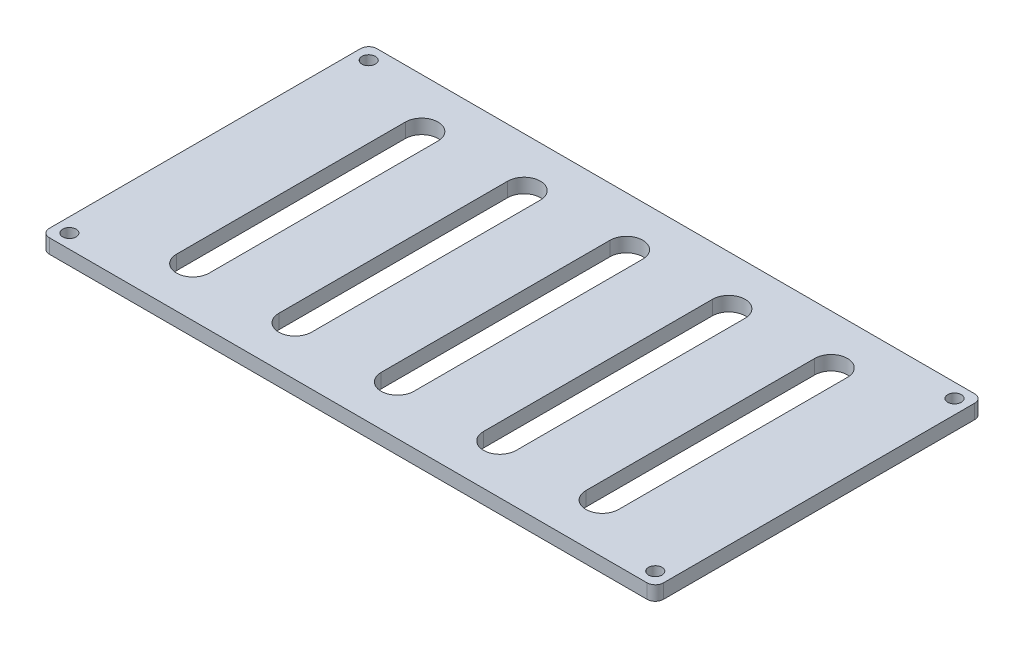
ISO-10303-21;
HEADER;
FILE_DESCRIPTION(('STEP AP214'),'2;1');
FILE_NAME('part.step','',(''),(''),'','','');
FILE_SCHEMA(('AUTOMOTIVE_DESIGN { 1 0 10303 214 1 1 1 1 }'));
ENDSEC;
DATA;
#1=APPLICATION_CONTEXT('core data for automotive mechanical design processes');
#2=APPLICATION_PROTOCOL_DEFINITION('international standard','automotive_design',2000,#1);
#3=PRODUCT_CONTEXT('',#1,'mechanical');
#4=PRODUCT('Part','Part','',(#3));
#5=PRODUCT_RELATED_PRODUCT_CATEGORY('part','',(#4));
#6=PRODUCT_DEFINITION_FORMATION('','',#4);
#7=PRODUCT_DEFINITION_CONTEXT('part definition',#1,'design');
#8=PRODUCT_DEFINITION('design','',#6,#7);
#9=PRODUCT_DEFINITION_SHAPE('','',#8);
#10=(LENGTH_UNIT() NAMED_UNIT(*) SI_UNIT(.MILLI.,.METRE.));
#11=(NAMED_UNIT(*) PLANE_ANGLE_UNIT() SI_UNIT($,.RADIAN.));
#12=(NAMED_UNIT(*) SI_UNIT($,.STERADIAN.) SOLID_ANGLE_UNIT());
#13=UNCERTAINTY_MEASURE_WITH_UNIT(LENGTH_MEASURE(1.E-05),#10,'distance_accuracy_value','');
#14=(GEOMETRIC_REPRESENTATION_CONTEXT(3) GLOBAL_UNCERTAINTY_ASSIGNED_CONTEXT((#13)) GLOBAL_UNIT_ASSIGNED_CONTEXT((#10,
#11,#12)) REPRESENTATION_CONTEXT('',''));
#15=CARTESIAN_POINT('',(0.,0.,0.));
#16=DIRECTION('',(0.,0.,1.));
#17=DIRECTION('',(1.,0.,0.));
#18=AXIS2_PLACEMENT_3D('',#15,#16,#17);
#19=CARTESIAN_POINT('',(-73.,3.5,-38.));
#20=DIRECTION('',(0.,-1.,0.));
#21=DIRECTION('',(0.,0.,-1.));
#22=AXIS2_PLACEMENT_3D('',#19,#20,#21);
#23=CYLINDRICAL_SURFACE('',#22,2.);
#24=CARTESIAN_POINT('',(-73.,0.,-38.));
#25=DIRECTION('',(0.,1.,0.));
#26=DIRECTION('',(0.,0.,1.));
#27=AXIS2_PLACEMENT_3D('',#24,#25,#26);
#28=CIRCLE('',#27,2.);
#29=CARTESIAN_POINT('',(-75.,0.,-38.));
#30=VERTEX_POINT('',#29);
#31=CARTESIAN_POINT('',(-73.,0.,-40.));
#32=VERTEX_POINT('',#31);
#33=EDGE_CURVE('E361',#30,#32,#28,.F.);
#34=ORIENTED_EDGE('',*,*,#33,.F.);
#35=DIRECTION('',(0.,-1.,0.));
#36=VECTOR('',#35,1.);
#37=CARTESIAN_POINT('',(-75.,3.5,-38.));
#38=LINE('',#37,#36);
#39=CARTESIAN_POINT('',(-75.,3.5,-38.));
#40=VERTEX_POINT('',#39);
#41=EDGE_CURVE('E11',#40,#30,#38,.T.);
#42=ORIENTED_EDGE('',*,*,#41,.F.);
#43=CARTESIAN_POINT('',(-73.,3.5,-38.));
#44=DIRECTION('',(0.,1.,0.));
#45=DIRECTION('',(0.,0.,1.));
#46=AXIS2_PLACEMENT_3D('',#43,#44,#45);
#47=CIRCLE('',#46,2.);
#48=CARTESIAN_POINT('',(-73.,3.5,-40.));
#49=VERTEX_POINT('',#48);
#50=EDGE_CURVE('E566',#40,#49,#47,.F.);
#51=ORIENTED_EDGE('',*,*,#50,.T.);
#52=DIRECTION('',(0.,-1.,0.));
#53=VECTOR('',#52,1.);
#54=CARTESIAN_POINT('',(-73.,3.5,-40.));
#55=LINE('',#54,#53);
#56=EDGE_CURVE('E59',#49,#32,#55,.T.);
#57=ORIENTED_EDGE('',*,*,#56,.T.);
#58=EDGE_LOOP('',(#34,#42,#51,#57));
#59=FACE_BOUND('',#58,.T.);
#60=ADVANCED_FACE('F39',(#59),#23,.T.);
#61=CARTESIAN_POINT('',(-75.,3.5,0.));
#62=DIRECTION('',(-1.,0.,0.));
#63=DIRECTION('',(0.,0.,1.));
#64=AXIS2_PLACEMENT_3D('',#61,#62,#63);
#65=PLANE('',#64);
#66=DIRECTION('',(0.,0.,-1.));
#67=VECTOR('',#66,1.);
#68=CARTESIAN_POINT('',(-75.,0.,0.));
#69=LINE('',#68,#67);
#70=CARTESIAN_POINT('',(-75.,0.,38.));
#71=VERTEX_POINT('',#70);
#72=EDGE_CURVE('E364',#71,#30,#69,.T.);
#73=ORIENTED_EDGE('',*,*,#72,.F.);
#74=DIRECTION('',(0.,-1.,0.));
#75=VECTOR('',#74,1.);
#76=CARTESIAN_POINT('',(-75.,3.5,38.));
#77=LINE('',#76,#75);
#78=CARTESIAN_POINT('',(-75.,3.5,38.));
#79=VERTEX_POINT('',#78);
#80=EDGE_CURVE('E50',#79,#71,#77,.T.);
#81=ORIENTED_EDGE('',*,*,#80,.F.);
#82=DIRECTION('',(0.,0.,-1.));
#83=VECTOR('',#82,1.);
#84=CARTESIAN_POINT('',(-75.,3.5,0.));
#85=LINE('',#84,#83);
#86=EDGE_CURVE('E569',#79,#40,#85,.T.);
#87=ORIENTED_EDGE('',*,*,#86,.T.);
#88=ORIENTED_EDGE('',*,*,#41,.T.);
#89=EDGE_LOOP('',(#73,#81,#87,#88));
#90=FACE_BOUND('',#89,.T.);
#91=ADVANCED_FACE('F603',(#90),#65,.T.);
#92=CARTESIAN_POINT('',(-73.,3.5,38.));
#93=DIRECTION('',(0.,-1.,0.));
#94=DIRECTION('',(0.,0.,-1.));
#95=AXIS2_PLACEMENT_3D('',#92,#93,#94);
#96=CYLINDRICAL_SURFACE('',#95,2.);
#97=CARTESIAN_POINT('',(-73.,0.,38.));
#98=DIRECTION('',(0.,1.,0.));
#99=DIRECTION('',(0.,0.,1.));
#100=AXIS2_PLACEMENT_3D('',#97,#98,#99);
#101=CIRCLE('',#100,2.);
#102=CARTESIAN_POINT('',(-73.,0.,40.));
#103=VERTEX_POINT('',#102);
#104=EDGE_CURVE('E368',#103,#71,#101,.F.);
#105=ORIENTED_EDGE('',*,*,#104,.F.);
#106=DIRECTION('',(0.,-1.,0.));
#107=VECTOR('',#106,1.);
#108=CARTESIAN_POINT('',(-73.,3.5,40.));
#109=LINE('',#108,#107);
#110=CARTESIAN_POINT('',(-73.,3.5,40.));
#111=VERTEX_POINT('',#110);
#112=EDGE_CURVE('E408',#111,#103,#109,.T.);
#113=ORIENTED_EDGE('',*,*,#112,.F.);
#114=CARTESIAN_POINT('',(-73.,3.5,38.));
#115=DIRECTION('',(0.,1.,0.));
#116=DIRECTION('',(0.,0.,1.));
#117=AXIS2_PLACEMENT_3D('',#114,#115,#116);
#118=CIRCLE('',#117,2.);
#119=EDGE_CURVE('E573',#111,#79,#118,.F.);
#120=ORIENTED_EDGE('',*,*,#119,.T.);
#121=ORIENTED_EDGE('',*,*,#80,.T.);
#122=EDGE_LOOP('',(#105,#113,#120,#121));
#123=FACE_BOUND('',#122,.T.);
#124=ADVANCED_FACE('F608',(#123),#96,.T.);
#125=CARTESIAN_POINT('',(0.,3.5,40.));
#126=DIRECTION('',(0.,0.,-1.));
#127=DIRECTION('',(-1.,0.,0.));
#128=AXIS2_PLACEMENT_3D('',#125,#126,#127);
#129=PLANE('',#128);
#130=DIRECTION('',(1.,0.,0.));
#131=VECTOR('',#130,1.);
#132=CARTESIAN_POINT('',(0.,0.,40.));
#133=LINE('',#132,#131);
#134=CARTESIAN_POINT('',(73.,0.,40.));
#135=VERTEX_POINT('',#134);
#136=EDGE_CURVE('E372',#103,#135,#133,.T.);
#137=ORIENTED_EDGE('',*,*,#136,.T.);
#138=DIRECTION('',(0.,-1.,0.));
#139=VECTOR('',#138,1.);
#140=CARTESIAN_POINT('',(73.,3.5,40.));
#141=LINE('',#140,#139);
#142=CARTESIAN_POINT('',(73.,3.5,40.));
#143=VERTEX_POINT('',#142);
#144=EDGE_CURVE('E405',#143,#135,#141,.T.);
#145=ORIENTED_EDGE('',*,*,#144,.F.);
#146=DIRECTION('',(1.,0.,0.));
#147=VECTOR('',#146,1.);
#148=CARTESIAN_POINT('',(0.,3.5,40.));
#149=LINE('',#148,#147);
#150=EDGE_CURVE('E577',#111,#143,#149,.T.);
#151=ORIENTED_EDGE('',*,*,#150,.F.);
#152=ORIENTED_EDGE('',*,*,#112,.T.);
#153=EDGE_LOOP('',(#137,#145,#151,#152));
#154=FACE_BOUND('',#153,.T.);
#155=ADVANCED_FACE('F755',(#154),#129,.F.);
#156=CARTESIAN_POINT('',(73.,3.5,38.));
#157=DIRECTION('',(0.,-1.,0.));
#158=DIRECTION('',(0.,0.,-1.));
#159=AXIS2_PLACEMENT_3D('',#156,#157,#158);
#160=CYLINDRICAL_SURFACE('',#159,2.);
#161=CARTESIAN_POINT('',(73.,0.,38.));
#162=DIRECTION('',(0.,1.,0.));
#163=DIRECTION('',(0.,0.,1.));
#164=AXIS2_PLACEMENT_3D('',#161,#162,#163);
#165=CIRCLE('',#164,2.);
#166=CARTESIAN_POINT('',(75.,0.,38.));
#167=VERTEX_POINT('',#166);
#168=EDGE_CURVE('E376',#167,#135,#165,.F.);
#169=ORIENTED_EDGE('',*,*,#168,.F.);
#170=DIRECTION('',(0.,-1.,0.));
#171=VECTOR('',#170,1.);
#172=CARTESIAN_POINT('',(75.,3.5,38.));
#173=LINE('',#172,#171);
#174=CARTESIAN_POINT('',(75.,3.5,38.));
#175=VERTEX_POINT('',#174);
#176=EDGE_CURVE('E254',#175,#167,#173,.T.);
#177=ORIENTED_EDGE('',*,*,#176,.F.);
#178=CARTESIAN_POINT('',(73.,3.5,38.));
#179=DIRECTION('',(0.,1.,0.));
#180=DIRECTION('',(0.,0.,1.));
#181=AXIS2_PLACEMENT_3D('',#178,#179,#180);
#182=CIRCLE('',#181,2.);
#183=EDGE_CURVE('E242',#175,#143,#182,.F.);
#184=ORIENTED_EDGE('',*,*,#183,.T.);
#185=ORIENTED_EDGE('',*,*,#144,.T.);
#186=EDGE_LOOP('',(#169,#177,#184,#185));
#187=FACE_BOUND('',#186,.T.);
#188=ADVANCED_FACE('F582',(#187),#160,.T.);
#189=CARTESIAN_POINT('',(75.,3.5,0.));
#190=DIRECTION('',(-1.,0.,0.));
#191=DIRECTION('',(0.,0.,1.));
#192=AXIS2_PLACEMENT_3D('',#189,#190,#191);
#193=PLANE('',#192);
#194=DIRECTION('',(0.,0.,-1.));
#195=VECTOR('',#194,1.);
#196=CARTESIAN_POINT('',(75.,0.,0.));
#197=LINE('',#196,#195);
#198=CARTESIAN_POINT('',(75.,0.,-38.));
#199=VERTEX_POINT('',#198);
#200=EDGE_CURVE('E250',#167,#199,#197,.T.);
#201=ORIENTED_EDGE('',*,*,#200,.T.);
#202=DIRECTION('',(0.,-1.,0.));
#203=VECTOR('',#202,1.);
#204=CARTESIAN_POINT('',(75.,3.5,-38.));
#205=LINE('',#204,#203);
#206=CARTESIAN_POINT('',(75.,3.5,-38.));
#207=VERTEX_POINT('',#206);
#208=EDGE_CURVE('E247',#207,#199,#205,.T.);
#209=ORIENTED_EDGE('',*,*,#208,.F.);
#210=DIRECTION('',(0.,0.,-1.));
#211=VECTOR('',#210,1.);
#212=CARTESIAN_POINT('',(75.,3.5,0.));
#213=LINE('',#212,#211);
#214=EDGE_CURVE('E233',#175,#207,#213,.T.);
#215=ORIENTED_EDGE('',*,*,#214,.F.);
#216=ORIENTED_EDGE('',*,*,#176,.T.);
#217=EDGE_LOOP('',(#201,#209,#215,#216));
#218=FACE_BOUND('',#217,.T.);
#219=ADVANCED_FACE('F248',(#218),#193,.F.);
#220=CARTESIAN_POINT('',(73.,3.5,-38.));
#221=DIRECTION('',(0.,-1.,0.));
#222=DIRECTION('',(0.,0.,-1.));
#223=AXIS2_PLACEMENT_3D('',#220,#221,#222);
#224=CYLINDRICAL_SURFACE('',#223,2.);
#225=CARTESIAN_POINT('',(73.,0.,-38.));
#226=DIRECTION('',(0.,1.,0.));
#227=DIRECTION('',(0.,0.,1.));
#228=AXIS2_PLACEMENT_3D('',#225,#226,#227);
#229=CIRCLE('',#228,2.);
#230=CARTESIAN_POINT('',(73.,0.,-40.));
#231=VERTEX_POINT('',#230);
#232=EDGE_CURVE('E382',#231,#199,#229,.F.);
#233=ORIENTED_EDGE('',*,*,#232,.F.);
#234=DIRECTION('',(0.,-1.,0.));
#235=VECTOR('',#234,1.);
#236=CARTESIAN_POINT('',(73.,3.5,-40.));
#237=LINE('',#236,#235);
#238=CARTESIAN_POINT('',(73.,3.5,-40.));
#239=VERTEX_POINT('',#238);
#240=EDGE_CURVE('E144',#239,#231,#237,.T.);
#241=ORIENTED_EDGE('',*,*,#240,.F.);
#242=CARTESIAN_POINT('',(73.,3.5,-38.));
#243=DIRECTION('',(0.,1.,0.));
#244=DIRECTION('',(0.,0.,1.));
#245=AXIS2_PLACEMENT_3D('',#242,#243,#244);
#246=CIRCLE('',#245,2.);
#247=EDGE_CURVE('E240',#239,#207,#246,.F.);
#248=ORIENTED_EDGE('',*,*,#247,.T.);
#249=ORIENTED_EDGE('',*,*,#208,.T.);
#250=EDGE_LOOP('',(#233,#241,#248,#249));
#251=FACE_BOUND('',#250,.T.);
#252=ADVANCED_FACE('F256',(#251),#224,.T.);
#253=CARTESIAN_POINT('',(0.,3.5,-27.9480885763133));
#254=DIRECTION('',(0.,-1.,0.));
#255=DIRECTION('',(0.,0.,-1.));
#256=AXIS2_PLACEMENT_3D('',#253,#254,#255);
#257=CYLINDRICAL_SURFACE('',#256,4.);
#258=CARTESIAN_POINT('',(0.,0.,-27.9480885763133));
#259=DIRECTION('',(0.,1.,0.));
#260=DIRECTION('',(0.,0.,1.));
#261=AXIS2_PLACEMENT_3D('',#258,#259,#260);
#262=CIRCLE('',#261,4.);
#263=CARTESIAN_POINT('',(4.,0.,-27.9480885763132));
#264=VERTEX_POINT('',#263);
#265=CARTESIAN_POINT('',(-4.,0.,-27.9480885763133));
#266=VERTEX_POINT('',#265);
#267=EDGE_CURVE('E337',#264,#266,#262,.T.);
#268=ORIENTED_EDGE('',*,*,#267,.F.);
#269=DIRECTION('',(0.,-1.,0.));
#270=VECTOR('',#269,1.);
#271=CARTESIAN_POINT('',(4.,3.5,-27.9480885763132));
#272=LINE('',#271,#270);
#273=CARTESIAN_POINT('',(4.,3.5,-27.9480885763132));
#274=VERTEX_POINT('',#273);
#275=EDGE_CURVE('E400',#274,#264,#272,.T.);
#276=ORIENTED_EDGE('',*,*,#275,.F.);
#277=CARTESIAN_POINT('',(0.,3.5,-27.9480885763133));
#278=DIRECTION('',(0.,1.,0.));
#279=DIRECTION('',(0.,0.,1.));
#280=AXIS2_PLACEMENT_3D('',#277,#278,#279);
#281=CIRCLE('',#280,4.);
#282=CARTESIAN_POINT('',(-4.,3.5,-27.9480885763133));
#283=VERTEX_POINT('',#282);
#284=EDGE_CURVE('E543',#274,#283,#281,.T.);
#285=ORIENTED_EDGE('',*,*,#284,.T.);
#286=DIRECTION('',(0.,-1.,0.));
#287=VECTOR('',#286,1.);
#288=CARTESIAN_POINT('',(-4.,3.5,-27.9480885763133));
#289=LINE('',#288,#287);
#290=EDGE_CURVE('E413',#283,#266,#289,.T.);
#291=ORIENTED_EDGE('',*,*,#290,.T.);
#292=EDGE_LOOP('',(#268,#276,#285,#291));
#293=FACE_BOUND('',#292,.T.);
#294=ADVANCED_FACE('F629',(#293),#257,.F.);
#295=CARTESIAN_POINT('',(3.99999999999981,3.5,0.));
#296=DIRECTION('',(-1.,0.,0.));
#297=DIRECTION('',(0.,0.,1.));
#298=AXIS2_PLACEMENT_3D('',#295,#296,#297);
#299=PLANE('',#298);
#300=DIRECTION('',(0.,0.,-1.));
#301=VECTOR('',#300,1.);
#302=CARTESIAN_POINT('',(3.99999999999981,0.,0.));
#303=LINE('',#302,#301);
#304=CARTESIAN_POINT('',(3.99999999999963,0.,27.957633289446));
#305=VERTEX_POINT('',#304);
#306=EDGE_CURVE('E341',#305,#264,#303,.T.);
#307=ORIENTED_EDGE('',*,*,#306,.F.);
#308=DIRECTION('',(0.,-1.,0.));
#309=VECTOR('',#308,1.);
#310=CARTESIAN_POINT('',(3.99999999999963,3.5,27.957633289446));
#311=LINE('',#310,#309);
#312=CARTESIAN_POINT('',(3.99999999999963,3.5,27.957633289446));
#313=VERTEX_POINT('',#312);
#314=EDGE_CURVE('E420',#313,#305,#311,.T.);
#315=ORIENTED_EDGE('',*,*,#314,.F.);
#316=DIRECTION('',(0.,0.,-1.));
#317=VECTOR('',#316,1.);
#318=CARTESIAN_POINT('',(3.99999999999981,3.5,0.));
#319=LINE('',#318,#317);
#320=EDGE_CURVE('E547',#313,#274,#319,.T.);
#321=ORIENTED_EDGE('',*,*,#320,.T.);
#322=ORIENTED_EDGE('',*,*,#275,.T.);
#323=EDGE_LOOP('',(#307,#315,#321,#322));
#324=FACE_BOUND('',#323,.T.);
#325=ADVANCED_FACE('F625',(#324),#299,.T.);
#326=CARTESIAN_POINT('',(-3.71664504728031E-13,3.5,27.9576332894459));
#327=DIRECTION('',(0.,-1.,0.));
#328=DIRECTION('',(0.,0.,-1.));
#329=AXIS2_PLACEMENT_3D('',#326,#327,#328);
#330=CYLINDRICAL_SURFACE('',#329,4.);
#331=CARTESIAN_POINT('',(-3.71664504728031E-13,0.,27.9576332894459));
#332=DIRECTION('',(0.,1.,0.));
#333=DIRECTION('',(0.,0.,1.));
#334=AXIS2_PLACEMENT_3D('',#331,#332,#333);
#335=CIRCLE('',#334,4.);
#336=CARTESIAN_POINT('',(-4.00000000000038,0.,27.9576332894459));
#337=VERTEX_POINT('',#336);
#338=EDGE_CURVE('E345',#337,#305,#335,.T.);
#339=ORIENTED_EDGE('',*,*,#338,.F.);
#340=DIRECTION('',(0.,-1.,0.));
#341=VECTOR('',#340,1.);
#342=CARTESIAN_POINT('',(-4.00000000000038,3.5,27.9576332894459));
#343=LINE('',#342,#341);
#344=CARTESIAN_POINT('',(-4.00000000000038,3.5,27.9576332894459));
#345=VERTEX_POINT('',#344);
#346=EDGE_CURVE('E416',#345,#337,#343,.T.);
#347=ORIENTED_EDGE('',*,*,#346,.F.);
#348=CARTESIAN_POINT('',(-3.71664504728031E-13,3.5,27.9576332894459));
#349=DIRECTION('',(0.,1.,0.));
#350=DIRECTION('',(0.,0.,1.));
#351=AXIS2_PLACEMENT_3D('',#348,#349,#350);
#352=CIRCLE('',#351,4.);
#353=EDGE_CURVE('E551',#345,#313,#352,.T.);
#354=ORIENTED_EDGE('',*,*,#353,.T.);
#355=ORIENTED_EDGE('',*,*,#314,.T.);
#356=EDGE_LOOP('',(#339,#347,#354,#355));
#357=FACE_BOUND('',#356,.T.);
#358=ADVANCED_FACE('F621',(#357),#330,.F.);
#359=CARTESIAN_POINT('',(25.,3.5,-27.9480885763133));
#360=DIRECTION('',(0.,-1.,0.));
#361=DIRECTION('',(0.,0.,-1.));
#362=AXIS2_PLACEMENT_3D('',#359,#360,#361);
#363=CYLINDRICAL_SURFACE('',#362,4.);
#364=CARTESIAN_POINT('',(25.,0.,-27.9480885763133));
#365=DIRECTION('',(0.,1.,0.));
#366=DIRECTION('',(0.,0.,1.));
#367=AXIS2_PLACEMENT_3D('',#364,#365,#366);
#368=CIRCLE('',#367,4.);
#369=CARTESIAN_POINT('',(29.,0.,-27.9480885763132));
#370=VERTEX_POINT('',#369);
#371=CARTESIAN_POINT('',(21.,0.,-27.9480885763133));
#372=VERTEX_POINT('',#371);
#373=EDGE_CURVE('E321',#370,#372,#368,.T.);
#374=ORIENTED_EDGE('',*,*,#373,.F.);
#375=DIRECTION('',(0.,-1.,0.));
#376=VECTOR('',#375,1.);
#377=CARTESIAN_POINT('',(29.,3.5,-27.9480885763132));
#378=LINE('',#377,#376);
#379=CARTESIAN_POINT('',(29.,3.5,-27.9480885763132));
#380=VERTEX_POINT('',#379);
#381=EDGE_CURVE('E417',#380,#370,#378,.T.);
#382=ORIENTED_EDGE('',*,*,#381,.F.);
#383=CARTESIAN_POINT('',(25.,3.5,-27.9480885763133));
#384=DIRECTION('',(0.,1.,0.));
#385=DIRECTION('',(0.,0.,1.));
#386=AXIS2_PLACEMENT_3D('',#383,#384,#385);
#387=CIRCLE('',#386,4.);
#388=CARTESIAN_POINT('',(21.,3.5,-27.9480885763133));
#389=VERTEX_POINT('',#388);
#390=EDGE_CURVE('E528',#380,#389,#387,.T.);
#391=ORIENTED_EDGE('',*,*,#390,.T.);
#392=DIRECTION('',(0.,-1.,0.));
#393=VECTOR('',#392,1.);
#394=CARTESIAN_POINT('',(21.,3.5,-27.9480885763133));
#395=LINE('',#394,#393);
#396=EDGE_CURVE('E425',#389,#372,#395,.T.);
#397=ORIENTED_EDGE('',*,*,#396,.T.);
#398=EDGE_LOOP('',(#374,#382,#391,#397));
#399=FACE_BOUND('',#398,.T.);
#400=ADVANCED_FACE('F624',(#399),#363,.F.);
#401=CARTESIAN_POINT('',(28.9999999999998,3.5,1.94368438343589E-13));
#402=DIRECTION('',(-1.,0.,0.));
#403=DIRECTION('',(0.,0.,1.));
#404=AXIS2_PLACEMENT_3D('',#401,#402,#403);
#405=PLANE('',#404);
#406=DIRECTION('',(0.,0.,-1.));
#407=VECTOR('',#406,1.);
#408=CARTESIAN_POINT('',(28.9999999999998,0.,1.94368438343589E-13));
#409=LINE('',#408,#407);
#410=CARTESIAN_POINT('',(28.9999999999996,0.,27.957633289446));
#411=VERTEX_POINT('',#410);
#412=EDGE_CURVE('E325',#411,#370,#409,.T.);
#413=ORIENTED_EDGE('',*,*,#412,.F.);
#414=DIRECTION('',(0.,-1.,0.));
#415=VECTOR('',#414,1.);
#416=CARTESIAN_POINT('',(28.9999999999996,3.5,27.957633289446));
#417=LINE('',#416,#415);
#418=CARTESIAN_POINT('',(28.9999999999996,3.5,27.957633289446));
#419=VERTEX_POINT('',#418);
#420=EDGE_CURVE('E432',#419,#411,#417,.T.);
#421=ORIENTED_EDGE('',*,*,#420,.F.);
#422=DIRECTION('',(0.,0.,-1.));
#423=VECTOR('',#422,1.);
#424=CARTESIAN_POINT('',(28.9999999999998,3.5,1.94368438343589E-13));
#425=LINE('',#424,#423);
#426=EDGE_CURVE('E532',#419,#380,#425,.T.);
#427=ORIENTED_EDGE('',*,*,#426,.T.);
#428=ORIENTED_EDGE('',*,*,#381,.T.);
#429=EDGE_LOOP('',(#413,#421,#427,#428));
#430=FACE_BOUND('',#429,.T.);
#431=ADVANCED_FACE('F642',(#430),#405,.T.);
#432=CARTESIAN_POINT('',(24.9999999999996,3.5,27.9576332894459));
#433=DIRECTION('',(0.,-1.,0.));
#434=DIRECTION('',(0.,0.,-1.));
#435=AXIS2_PLACEMENT_3D('',#432,#433,#434);
#436=CYLINDRICAL_SURFACE('',#435,4.);
#437=CARTESIAN_POINT('',(24.9999999999996,0.,27.9576332894459));
#438=DIRECTION('',(0.,1.,0.));
#439=DIRECTION('',(0.,0.,1.));
#440=AXIS2_PLACEMENT_3D('',#437,#438,#439);
#441=CIRCLE('',#440,4.);
#442=CARTESIAN_POINT('',(20.9999999999996,0.,27.9576332894459));
#443=VERTEX_POINT('',#442);
#444=EDGE_CURVE('E329',#443,#411,#441,.T.);
#445=ORIENTED_EDGE('',*,*,#444,.F.);
#446=DIRECTION('',(0.,-1.,0.));
#447=VECTOR('',#446,1.);
#448=CARTESIAN_POINT('',(20.9999999999996,3.5,27.9576332894459));
#449=LINE('',#448,#447);
#450=CARTESIAN_POINT('',(20.9999999999996,3.5,27.9576332894459));
#451=VERTEX_POINT('',#450);
#452=EDGE_CURVE('E428',#451,#443,#449,.T.);
#453=ORIENTED_EDGE('',*,*,#452,.F.);
#454=CARTESIAN_POINT('',(24.9999999999996,3.5,27.9576332894459));
#455=DIRECTION('',(0.,1.,0.));
#456=DIRECTION('',(0.,0.,1.));
#457=AXIS2_PLACEMENT_3D('',#454,#455,#456);
#458=CIRCLE('',#457,4.);
#459=EDGE_CURVE('E536',#451,#419,#458,.T.);
#460=ORIENTED_EDGE('',*,*,#459,.T.);
#461=ORIENTED_EDGE('',*,*,#420,.T.);
#462=EDGE_LOOP('',(#445,#453,#460,#461));
#463=FACE_BOUND('',#462,.T.);
#464=ADVANCED_FACE('F638',(#463),#436,.F.);
#465=CARTESIAN_POINT('',(50.,3.5,-27.9480885763133));
#466=DIRECTION('',(0.,-1.,0.));
#467=DIRECTION('',(0.,0.,-1.));
#468=AXIS2_PLACEMENT_3D('',#465,#466,#467);
#469=CYLINDRICAL_SURFACE('',#468,4.);
#470=CARTESIAN_POINT('',(50.,0.,-27.9480885763133));
#471=DIRECTION('',(0.,1.,0.));
#472=DIRECTION('',(0.,0.,1.));
#473=AXIS2_PLACEMENT_3D('',#470,#471,#472);
#474=CIRCLE('',#473,4.);
#475=CARTESIAN_POINT('',(54.,0.,-27.9480885763132));
#476=VERTEX_POINT('',#475);
#477=CARTESIAN_POINT('',(46.,0.,-27.9480885763133));
#478=VERTEX_POINT('',#477);
#479=EDGE_CURVE('E305',#476,#478,#474,.T.);
#480=ORIENTED_EDGE('',*,*,#479,.F.);
#481=DIRECTION('',(0.,-1.,0.));
#482=VECTOR('',#481,1.);
#483=CARTESIAN_POINT('',(54.,3.5,-27.9480885763132));
#484=LINE('',#483,#482);
#485=CARTESIAN_POINT('',(54.,3.5,-27.9480885763132));
#486=VERTEX_POINT('',#485);
#487=EDGE_CURVE('E429',#486,#476,#484,.T.);
#488=ORIENTED_EDGE('',*,*,#487,.F.);
#489=CARTESIAN_POINT('',(50.,3.5,-27.9480885763133));
#490=DIRECTION('',(0.,1.,0.));
#491=DIRECTION('',(0.,0.,1.));
#492=AXIS2_PLACEMENT_3D('',#489,#490,#491);
#493=CIRCLE('',#492,4.);
#494=CARTESIAN_POINT('',(46.,3.5,-27.9480885763133));
#495=VERTEX_POINT('',#494);
#496=EDGE_CURVE('E513',#486,#495,#493,.T.);
#497=ORIENTED_EDGE('',*,*,#496,.T.);
#498=DIRECTION('',(0.,-1.,0.));
#499=VECTOR('',#498,1.);
#500=CARTESIAN_POINT('',(46.,3.5,-27.9480885763133));
#501=LINE('',#500,#499);
#502=EDGE_CURVE('E437',#495,#478,#501,.T.);
#503=ORIENTED_EDGE('',*,*,#502,.T.);
#504=EDGE_LOOP('',(#480,#488,#497,#503));
#505=FACE_BOUND('',#504,.T.);
#506=ADVANCED_FACE('F641',(#505),#469,.F.);
#507=CARTESIAN_POINT('',(53.9999999999998,3.5,3.55225076972767E-13));
#508=DIRECTION('',(-1.,0.,0.));
#509=DIRECTION('',(0.,0.,1.));
#510=AXIS2_PLACEMENT_3D('',#507,#508,#509);
#511=PLANE('',#510);
#512=DIRECTION('',(0.,0.,-1.));
#513=VECTOR('',#512,1.);
#514=CARTESIAN_POINT('',(53.9999999999998,0.,3.55225076972767E-13));
#515=LINE('',#514,#513);
#516=CARTESIAN_POINT('',(53.9999999999996,0.,27.957633289446));
#517=VERTEX_POINT('',#516);
#518=EDGE_CURVE('E309',#517,#476,#515,.T.);
#519=ORIENTED_EDGE('',*,*,#518,.F.);
#520=DIRECTION('',(0.,-1.,0.));
#521=VECTOR('',#520,1.);
#522=CARTESIAN_POINT('',(53.9999999999996,3.5,27.957633289446));
#523=LINE('',#522,#521);
#524=CARTESIAN_POINT('',(53.9999999999996,3.5,27.957633289446));
#525=VERTEX_POINT('',#524);
#526=EDGE_CURVE('E444',#525,#517,#523,.T.);
#527=ORIENTED_EDGE('',*,*,#526,.F.);
#528=DIRECTION('',(0.,0.,-1.));
#529=VECTOR('',#528,1.);
#530=CARTESIAN_POINT('',(53.9999999999998,3.5,3.55225076972767E-13));
#531=LINE('',#530,#529);
#532=EDGE_CURVE('E517',#525,#486,#531,.T.);
#533=ORIENTED_EDGE('',*,*,#532,.T.);
#534=ORIENTED_EDGE('',*,*,#487,.T.);
#535=EDGE_LOOP('',(#519,#527,#533,#534));
#536=FACE_BOUND('',#535,.T.);
#537=ADVANCED_FACE('F658',(#536),#511,.T.);
#538=CARTESIAN_POINT('',(49.9999999999996,3.5,27.9576332894459));
#539=DIRECTION('',(0.,-1.,0.));
#540=DIRECTION('',(0.,0.,-1.));
#541=AXIS2_PLACEMENT_3D('',#538,#539,#540);
#542=CYLINDRICAL_SURFACE('',#541,4.);
#543=CARTESIAN_POINT('',(49.9999999999996,0.,27.9576332894459));
#544=DIRECTION('',(0.,1.,0.));
#545=DIRECTION('',(0.,0.,1.));
#546=AXIS2_PLACEMENT_3D('',#543,#544,#545);
#547=CIRCLE('',#546,4.);
#548=CARTESIAN_POINT('',(45.9999999999996,0.,27.9576332894459));
#549=VERTEX_POINT('',#548);
#550=EDGE_CURVE('E313',#549,#517,#547,.T.);
#551=ORIENTED_EDGE('',*,*,#550,.F.);
#552=DIRECTION('',(0.,-1.,0.));
#553=VECTOR('',#552,1.);
#554=CARTESIAN_POINT('',(45.9999999999996,3.5,27.9576332894459));
#555=LINE('',#554,#553);
#556=CARTESIAN_POINT('',(45.9999999999996,3.5,27.9576332894459));
#557=VERTEX_POINT('',#556);
#558=EDGE_CURVE('E440',#557,#549,#555,.T.);
#559=ORIENTED_EDGE('',*,*,#558,.F.);
#560=CARTESIAN_POINT('',(49.9999999999996,3.5,27.9576332894459));
#561=DIRECTION('',(0.,1.,0.));
#562=DIRECTION('',(0.,0.,1.));
#563=AXIS2_PLACEMENT_3D('',#560,#561,#562);
#564=CIRCLE('',#563,4.);
#565=EDGE_CURVE('E521',#557,#525,#564,.T.);
#566=ORIENTED_EDGE('',*,*,#565,.T.);
#567=ORIENTED_EDGE('',*,*,#526,.T.);
#568=EDGE_LOOP('',(#551,#559,#566,#567));
#569=FACE_BOUND('',#568,.T.);
#570=ADVANCED_FACE('F654',(#569),#542,.F.);
#571=CARTESIAN_POINT('',(-25.,3.5,-27.9480885763129));
#572=DIRECTION('',(0.,-1.,0.));
#573=DIRECTION('',(0.,0.,-1.));
#574=AXIS2_PLACEMENT_3D('',#571,#572,#573);
#575=CYLINDRICAL_SURFACE('',#574,4.);
#576=CARTESIAN_POINT('',(-25.,0.,-27.9480885763129));
#577=DIRECTION('',(0.,1.,0.));
#578=DIRECTION('',(0.,0.,1.));
#579=AXIS2_PLACEMENT_3D('',#576,#577,#578);
#580=CIRCLE('',#579,4.);
#581=CARTESIAN_POINT('',(-21.,0.,-27.9480885763129));
#582=VERTEX_POINT('',#581);
#583=CARTESIAN_POINT('',(-29.,0.,-27.9480885763129));
#584=VERTEX_POINT('',#583);
#585=EDGE_CURVE('E289',#582,#584,#580,.T.);
#586=ORIENTED_EDGE('',*,*,#585,.F.);
#587=DIRECTION('',(0.,-1.,0.));
#588=VECTOR('',#587,1.);
#589=CARTESIAN_POINT('',(-21.,3.5,-27.9480885763129));
#590=LINE('',#589,#588);
#591=CARTESIAN_POINT('',(-21.,3.5,-27.9480885763129));
#592=VERTEX_POINT('',#591);
#593=EDGE_CURVE('E441',#592,#582,#590,.T.);
#594=ORIENTED_EDGE('',*,*,#593,.F.);
#595=CARTESIAN_POINT('',(-25.,3.5,-27.9480885763129));
#596=DIRECTION('',(0.,1.,0.));
#597=DIRECTION('',(0.,0.,1.));
#598=AXIS2_PLACEMENT_3D('',#595,#596,#597);
#599=CIRCLE('',#598,4.);
#600=CARTESIAN_POINT('',(-29.,3.5,-27.9480885763129));
#601=VERTEX_POINT('',#600);
#602=EDGE_CURVE('E490',#592,#601,#599,.T.);
#603=ORIENTED_EDGE('',*,*,#602,.T.);
#604=DIRECTION('',(0.,-1.,0.));
#605=VECTOR('',#604,1.);
#606=CARTESIAN_POINT('',(-29.,3.5,-27.9480885763129));
#607=LINE('',#606,#605);
#608=EDGE_CURVE('E449',#601,#584,#607,.T.);
#609=ORIENTED_EDGE('',*,*,#608,.T.);
#610=EDGE_LOOP('',(#586,#594,#603,#609));
#611=FACE_BOUND('',#610,.T.);
#612=ADVANCED_FACE('F657',(#611),#575,.F.);
#613=CARTESIAN_POINT('',(-21.0000000000002,3.5,-1.40749558800532E-13));
#614=DIRECTION('',(-1.,0.,0.));
#615=DIRECTION('',(0.,0.,1.));
#616=AXIS2_PLACEMENT_3D('',#613,#614,#615);
#617=PLANE('',#616);
#618=DIRECTION('',(0.,0.,-1.));
#619=VECTOR('',#618,1.);
#620=CARTESIAN_POINT('',(-21.0000000000002,0.,-1.40749558800532E-13));
#621=LINE('',#620,#619);
#622=CARTESIAN_POINT('',(-21.0000000000004,0.,27.9576332894463));
#623=VERTEX_POINT('',#622);
#624=EDGE_CURVE('E293',#623,#582,#621,.T.);
#625=ORIENTED_EDGE('',*,*,#624,.F.);
#626=DIRECTION('',(0.,-1.,0.));
#627=VECTOR('',#626,1.);
#628=CARTESIAN_POINT('',(-21.0000000000004,3.5,27.9576332894463));
#629=LINE('',#628,#627);
#630=CARTESIAN_POINT('',(-21.0000000000004,3.5,27.9576332894463));
#631=VERTEX_POINT('',#630);
#632=EDGE_CURVE('E455',#631,#623,#629,.T.);
#633=ORIENTED_EDGE('',*,*,#632,.F.);
#634=DIRECTION('',(0.,0.,-1.));
#635=VECTOR('',#634,1.);
#636=CARTESIAN_POINT('',(-21.0000000000002,3.5,-1.40749558800532E-13));
#637=LINE('',#636,#635);
#638=EDGE_CURVE('E502',#631,#592,#637,.T.);
#639=ORIENTED_EDGE('',*,*,#638,.T.);
#640=ORIENTED_EDGE('',*,*,#593,.T.);
#641=EDGE_LOOP('',(#625,#633,#639,#640));
#642=FACE_BOUND('',#641,.T.);
#643=ADVANCED_FACE('F672',(#642),#617,.T.);
#644=CARTESIAN_POINT('',(-25.0000000000004,3.5,27.9576332894463));
#645=DIRECTION('',(0.,-1.,0.));
#646=DIRECTION('',(0.,0.,-1.));
#647=AXIS2_PLACEMENT_3D('',#644,#645,#646);
#648=CYLINDRICAL_SURFACE('',#647,4.);
#649=CARTESIAN_POINT('',(-25.0000000000004,0.,27.9576332894463));
#650=DIRECTION('',(0.,1.,0.));
#651=DIRECTION('',(0.,0.,1.));
#652=AXIS2_PLACEMENT_3D('',#649,#650,#651);
#653=CIRCLE('',#652,4.);
#654=CARTESIAN_POINT('',(-29.0000000000004,0.,27.9576332894462));
#655=VERTEX_POINT('',#654);
#656=EDGE_CURVE('E297',#655,#623,#653,.T.);
#657=ORIENTED_EDGE('',*,*,#656,.F.);
#658=DIRECTION('',(0.,-1.,0.));
#659=VECTOR('',#658,1.);
#660=CARTESIAN_POINT('',(-29.0000000000004,3.5,27.9576332894462));
#661=LINE('',#660,#659);
#662=CARTESIAN_POINT('',(-29.0000000000004,3.5,27.9576332894462));
#663=VERTEX_POINT('',#662);
#664=EDGE_CURVE('E452',#663,#655,#661,.T.);
#665=ORIENTED_EDGE('',*,*,#664,.F.);
#666=CARTESIAN_POINT('',(-25.0000000000004,3.5,27.9576332894463));
#667=DIRECTION('',(0.,1.,0.));
#668=DIRECTION('',(0.,0.,1.));
#669=AXIS2_PLACEMENT_3D('',#666,#667,#668);
#670=CIRCLE('',#669,4.);
#671=EDGE_CURVE('E506',#663,#631,#670,.T.);
#672=ORIENTED_EDGE('',*,*,#671,.T.);
#673=ORIENTED_EDGE('',*,*,#632,.T.);
#674=EDGE_LOOP('',(#657,#665,#672,#673));
#675=FACE_BOUND('',#674,.T.);
#676=ADVANCED_FACE('F669',(#675),#648,.F.);
#677=CARTESIAN_POINT('',(-50.,3.5,-27.9480885763129));
#678=DIRECTION('',(0.,-1.,0.));
#679=DIRECTION('',(0.,0.,-1.));
#680=AXIS2_PLACEMENT_3D('',#677,#678,#679);
#681=CYLINDRICAL_SURFACE('',#680,4.);
#682=CARTESIAN_POINT('',(-50.,0.,-27.9480885763129));
#683=DIRECTION('',(0.,1.,0.));
#684=DIRECTION('',(0.,0.,1.));
#685=AXIS2_PLACEMENT_3D('',#682,#683,#684);
#686=CIRCLE('',#685,4.);
#687=CARTESIAN_POINT('',(-46.,0.,-27.9480885763129));
#688=VERTEX_POINT('',#687);
#689=CARTESIAN_POINT('',(-54.,0.,-27.9480885763129));
#690=VERTEX_POINT('',#689);
#691=EDGE_CURVE('E273',#688,#690,#686,.T.);
#692=ORIENTED_EDGE('',*,*,#691,.F.);
#693=DIRECTION('',(0.,-1.,0.));
#694=VECTOR('',#693,1.);
#695=CARTESIAN_POINT('',(-46.,3.5,-27.9480885763129));
#696=LINE('',#695,#694);
#697=CARTESIAN_POINT('',(-46.,3.5,-27.9480885763129));
#698=VERTEX_POINT('',#697);
#699=EDGE_CURVE('E43',#698,#688,#696,.T.);
#700=ORIENTED_EDGE('',*,*,#699,.F.);
#701=CARTESIAN_POINT('',(-50.,3.5,-27.9480885763129));
#702=DIRECTION('',(0.,1.,0.));
#703=DIRECTION('',(0.,0.,1.));
#704=AXIS2_PLACEMENT_3D('',#701,#702,#703);
#705=CIRCLE('',#704,4.);
#706=CARTESIAN_POINT('',(-54.,3.5,-27.9480885763129));
#707=VERTEX_POINT('',#706);
#708=EDGE_CURVE('E397',#698,#707,#705,.T.);
#709=ORIENTED_EDGE('',*,*,#708,.T.);
#710=DIRECTION('',(0.,-1.,0.));
#711=VECTOR('',#710,1.);
#712=CARTESIAN_POINT('',(-54.,3.5,-27.9480885763129));
#713=LINE('',#712,#711);
#714=EDGE_CURVE('E272',#707,#690,#713,.T.);
#715=ORIENTED_EDGE('',*,*,#714,.T.);
#716=EDGE_LOOP('',(#692,#700,#709,#715));
#717=FACE_BOUND('',#716,.T.);
#718=ADVANCED_FACE('F41',(#717),#681,.F.);
#719=CARTESIAN_POINT('',(-46.0000000000002,3.5,-3.02599139643471E-13));
#720=DIRECTION('',(-1.,0.,0.));
#721=DIRECTION('',(0.,0.,1.));
#722=AXIS2_PLACEMENT_3D('',#719,#720,#721);
#723=PLANE('',#722);
#724=DIRECTION('',(0.,0.,-1.));
#725=VECTOR('',#724,1.);
#726=CARTESIAN_POINT('',(-46.0000000000002,0.,-3.02599139643471E-13));
#727=LINE('',#726,#725);
#728=CARTESIAN_POINT('',(-46.0000000000004,0.,27.9576332894463));
#729=VERTEX_POINT('',#728);
#730=EDGE_CURVE('E277',#729,#688,#727,.T.);
#731=ORIENTED_EDGE('',*,*,#730,.F.);
#732=DIRECTION('',(0.,-1.,0.));
#733=VECTOR('',#732,1.);
#734=CARTESIAN_POINT('',(-46.0000000000004,3.5,27.9576332894463));
#735=LINE('',#734,#733);
#736=CARTESIAN_POINT('',(-46.0000000000004,3.5,27.9576332894463));
#737=VERTEX_POINT('',#736);
#738=EDGE_CURVE('E464',#737,#729,#735,.T.);
#739=ORIENTED_EDGE('',*,*,#738,.F.);
#740=DIRECTION('',(0.,0.,-1.));
#741=VECTOR('',#740,1.);
#742=CARTESIAN_POINT('',(-46.0000000000002,3.5,-3.02599139643471E-13));
#743=LINE('',#742,#741);
#744=EDGE_CURVE('E475',#737,#698,#743,.T.);
#745=ORIENTED_EDGE('',*,*,#744,.T.);
#746=ORIENTED_EDGE('',*,*,#699,.T.);
#747=EDGE_LOOP('',(#731,#739,#745,#746));
#748=FACE_BOUND('',#747,.T.);
#749=ADVANCED_FACE('F473',(#748),#723,.T.);
#750=CARTESIAN_POINT('',(-50.0000000000004,3.5,27.9576332894463));
#751=DIRECTION('',(0.,-1.,0.));
#752=DIRECTION('',(0.,0.,-1.));
#753=AXIS2_PLACEMENT_3D('',#750,#751,#752);
#754=CYLINDRICAL_SURFACE('',#753,4.);
#755=CARTESIAN_POINT('',(-50.0000000000004,0.,27.9576332894463));
#756=DIRECTION('',(0.,1.,0.));
#757=DIRECTION('',(0.,0.,1.));
#758=AXIS2_PLACEMENT_3D('',#755,#756,#757);
#759=CIRCLE('',#758,4.);
#760=CARTESIAN_POINT('',(-54.0000000000004,0.,27.9576332894462));
#761=VERTEX_POINT('',#760);
#762=EDGE_CURVE('E281',#761,#729,#759,.T.);
#763=ORIENTED_EDGE('',*,*,#762,.F.);
#764=DIRECTION('',(0.,-1.,0.));
#765=VECTOR('',#764,1.);
#766=CARTESIAN_POINT('',(-54.0000000000004,3.5,27.9576332894462));
#767=LINE('',#766,#765);
#768=CARTESIAN_POINT('',(-54.0000000000004,3.5,27.9576332894462));
#769=VERTEX_POINT('',#768);
#770=EDGE_CURVE('E462',#769,#761,#767,.T.);
#771=ORIENTED_EDGE('',*,*,#770,.F.);
#772=CARTESIAN_POINT('',(-50.0000000000004,3.5,27.9576332894463));
#773=DIRECTION('',(0.,1.,0.));
#774=DIRECTION('',(0.,0.,1.));
#775=AXIS2_PLACEMENT_3D('',#772,#773,#774);
#776=CIRCLE('',#775,4.);
#777=EDGE_CURVE('E484',#769,#737,#776,.T.);
#778=ORIENTED_EDGE('',*,*,#777,.T.);
#779=ORIENTED_EDGE('',*,*,#738,.T.);
#780=EDGE_LOOP('',(#763,#771,#778,#779));
#781=FACE_BOUND('',#780,.T.);
#782=ADVANCED_FACE('F481',(#781),#754,.F.);
#783=CARTESIAN_POINT('',(71.5428932188134,3.5,36.5524379319461));
#784=DIRECTION('',(0.,-1.,0.));
#785=DIRECTION('',(0.,0.,-1.));
#786=AXIS2_PLACEMENT_3D('',#783,#784,#785);
#787=CYLINDRICAL_SURFACE('',#786,1.65);
#788=CARTESIAN_POINT('',(71.5428932188134,3.5,36.5524379319461));
#789=DIRECTION('',(0.,1.,0.));
#790=DIRECTION('',(0.,0.,1.));
#791=AXIS2_PLACEMENT_3D('',#788,#789,#790);
#792=CIRCLE('',#791,1.65);
#793=CARTESIAN_POINT('',(71.5428932188134,3.5,38.2024379319461));
#794=VERTEX_POINT('',#793);
#795=EDGE_CURVE('E261',#794,#794,#792,.T.);
#796=ORIENTED_EDGE('',*,*,#795,.T.);
#797=EDGE_LOOP('',(#796));
#798=FACE_BOUND('',#797,.T.);
#799=CARTESIAN_POINT('',(71.5428932188134,0.,36.5524379319461));
#800=DIRECTION('',(0.,1.,0.));
#801=DIRECTION('',(0.,0.,1.));
#802=AXIS2_PLACEMENT_3D('',#799,#800,#801);
#803=CIRCLE('',#802,1.65);
#804=CARTESIAN_POINT('',(71.5428932188134,0.,38.2024379319461));
#805=VERTEX_POINT('',#804);
#806=EDGE_CURVE('E389',#805,#805,#803,.T.);
#807=ORIENTED_EDGE('',*,*,#806,.F.);
#808=EDGE_LOOP('',(#807));
#809=FACE_BOUND('',#808,.T.);
#810=ADVANCED_FACE('F590',(#798,#809),#787,.F.);
#811=CARTESIAN_POINT('',(0.,3.5,-40.));
#812=DIRECTION('',(0.,0.,-1.));
#813=DIRECTION('',(-1.,0.,0.));
#814=AXIS2_PLACEMENT_3D('',#811,#812,#813);
#815=PLANE('',#814);
#816=DIRECTION('',(1.,0.,0.));
#817=VECTOR('',#816,1.);
#818=CARTESIAN_POINT('',(0.,0.,-40.));
#819=LINE('',#818,#817);
#820=EDGE_CURVE('E385',#32,#231,#819,.T.);
#821=ORIENTED_EDGE('',*,*,#820,.F.);
#822=ORIENTED_EDGE('',*,*,#56,.F.);
#823=DIRECTION('',(1.,0.,0.));
#824=VECTOR('',#823,1.);
#825=CARTESIAN_POINT('',(0.,3.5,-40.));
#826=LINE('',#825,#824);
#827=EDGE_CURVE('E258',#49,#239,#826,.T.);
#828=ORIENTED_EDGE('',*,*,#827,.T.);
#829=ORIENTED_EDGE('',*,*,#240,.T.);
#830=EDGE_LOOP('',(#821,#822,#828,#829));
#831=FACE_BOUND('',#830,.T.);
#832=ADVANCED_FACE('F587',(#831),#815,.T.);
#833=CARTESIAN_POINT('',(-71.5428932188134,3.5,-36.5428932188134));
#834=DIRECTION('',(0.,-1.,0.));
#835=DIRECTION('',(0.,0.,-1.));
#836=AXIS2_PLACEMENT_3D('',#833,#834,#835);
#837=CYLINDRICAL_SURFACE('',#836,1.65);
#838=CARTESIAN_POINT('',(-71.5428932188134,3.5,-36.5428932188134));
#839=DIRECTION('',(0.,1.,0.));
#840=DIRECTION('',(0.,0.,1.));
#841=AXIS2_PLACEMENT_3D('',#838,#839,#840);
#842=CIRCLE('',#841,1.65);
#843=CARTESIAN_POINT('',(-71.5428932188134,3.5,-34.8928932188134));
#844=VERTEX_POINT('',#843);
#845=EDGE_CURVE('E562',#844,#844,#842,.T.);
#846=ORIENTED_EDGE('',*,*,#845,.T.);
#847=EDGE_LOOP('',(#846));
#848=FACE_BOUND('',#847,.T.);
#849=CARTESIAN_POINT('',(-71.5428932188134,0.,-36.5428932188134));
#850=DIRECTION('',(0.,1.,0.));
#851=DIRECTION('',(0.,0.,1.));
#852=AXIS2_PLACEMENT_3D('',#849,#850,#851);
#853=CIRCLE('',#852,1.65);
#854=CARTESIAN_POINT('',(-71.5428932188134,0.,-34.8928932188134));
#855=VERTEX_POINT('',#854);
#856=EDGE_CURVE('E357',#855,#855,#853,.T.);
#857=ORIENTED_EDGE('',*,*,#856,.F.);
#858=EDGE_LOOP('',(#857));
#859=FACE_BOUND('',#858,.T.);
#860=ADVANCED_FACE('F589',(#848,#859),#837,.F.);
#861=CARTESIAN_POINT('',(71.5428932188134,3.5,-36.5428932188134));
#862=DIRECTION('',(0.,-1.,0.));
#863=DIRECTION('',(0.,0.,-1.));
#864=AXIS2_PLACEMENT_3D('',#861,#862,#863);
#865=CYLINDRICAL_SURFACE('',#864,1.65);
#866=CARTESIAN_POINT('',(71.5428932188134,3.5,-36.5428932188134));
#867=DIRECTION('',(0.,1.,0.));
#868=DIRECTION('',(0.,0.,1.));
#869=AXIS2_PLACEMENT_3D('',#866,#867,#868);
#870=CIRCLE('',#869,1.65);
#871=CARTESIAN_POINT('',(71.5428932188134,3.5,-34.8928932188134));
#872=VERTEX_POINT('',#871);
#873=EDGE_CURVE('E558',#872,#872,#870,.F.);
#874=ORIENTED_EDGE('',*,*,#873,.F.);
#875=EDGE_LOOP('',(#874));
#876=FACE_BOUND('',#875,.T.);
#877=CARTESIAN_POINT('',(71.5428932188134,0.,-36.5428932188134));
#878=DIRECTION('',(0.,1.,0.));
#879=DIRECTION('',(0.,0.,1.));
#880=AXIS2_PLACEMENT_3D('',#877,#878,#879);
#881=CIRCLE('',#880,1.65);
#882=CARTESIAN_POINT('',(71.5428932188134,0.,-34.8928932188134));
#883=VERTEX_POINT('',#882);
#884=EDGE_CURVE('E353',#883,#883,#881,.F.);
#885=ORIENTED_EDGE('',*,*,#884,.T.);
#886=EDGE_LOOP('',(#885));
#887=FACE_BOUND('',#886,.T.);
#888=ADVANCED_FACE('F596',(#876,#887),#865,.F.);
#889=CARTESIAN_POINT('',(-4.00000000000019,3.5,0.));
#890=DIRECTION('',(-1.,0.,0.));
#891=DIRECTION('',(0.,0.,1.));
#892=AXIS2_PLACEMENT_3D('',#889,#890,#891);
#893=PLANE('',#892);
#894=DIRECTION('',(0.,0.,-1.));
#895=VECTOR('',#894,1.);
#896=CARTESIAN_POINT('',(-4.00000000000019,0.,0.));
#897=LINE('',#896,#895);
#898=EDGE_CURVE('E349',#337,#266,#897,.T.);
#899=ORIENTED_EDGE('',*,*,#898,.T.);
#900=ORIENTED_EDGE('',*,*,#290,.F.);
#901=DIRECTION('',(0.,0.,-1.));
#902=VECTOR('',#901,1.);
#903=CARTESIAN_POINT('',(-4.00000000000019,3.5,0.));
#904=LINE('',#903,#902);
#905=EDGE_CURVE('E555',#345,#283,#904,.T.);
#906=ORIENTED_EDGE('',*,*,#905,.F.);
#907=ORIENTED_EDGE('',*,*,#346,.T.);
#908=EDGE_LOOP('',(#899,#900,#906,#907));
#909=FACE_BOUND('',#908,.T.);
#910=ADVANCED_FACE('F615',(#909),#893,.F.);
#911=CARTESIAN_POINT('',(20.9999999999998,3.5,1.4074955880053E-13));
#912=DIRECTION('',(-1.,0.,0.));
#913=DIRECTION('',(0.,0.,1.));
#914=AXIS2_PLACEMENT_3D('',#911,#912,#913);
#915=PLANE('',#914);
#916=DIRECTION('',(0.,0.,-1.));
#917=VECTOR('',#916,1.);
#918=CARTESIAN_POINT('',(20.9999999999998,0.,1.4074955880053E-13));
#919=LINE('',#918,#917);
#920=EDGE_CURVE('E333',#443,#372,#919,.T.);
#921=ORIENTED_EDGE('',*,*,#920,.T.);
#922=ORIENTED_EDGE('',*,*,#396,.F.);
#923=DIRECTION('',(0.,0.,-1.));
#924=VECTOR('',#923,1.);
#925=CARTESIAN_POINT('',(20.9999999999998,3.5,1.4074955880053E-13));
#926=LINE('',#925,#924);
#927=EDGE_CURVE('E540',#451,#389,#926,.T.);
#928=ORIENTED_EDGE('',*,*,#927,.F.);
#929=ORIENTED_EDGE('',*,*,#452,.T.);
#930=EDGE_LOOP('',(#921,#922,#928,#929));
#931=FACE_BOUND('',#930,.T.);
#932=ADVANCED_FACE('F619',(#931),#915,.F.);
#933=CARTESIAN_POINT('',(45.9999999999998,3.5,3.0830855737259E-13));
#934=DIRECTION('',(-1.,0.,0.));
#935=DIRECTION('',(0.,0.,1.));
#936=AXIS2_PLACEMENT_3D('',#933,#934,#935);
#937=PLANE('',#936);
#938=DIRECTION('',(0.,0.,-1.));
#939=VECTOR('',#938,1.);
#940=CARTESIAN_POINT('',(45.9999999999998,0.,3.0830855737259E-13));
#941=LINE('',#940,#939);
#942=EDGE_CURVE('E317',#549,#478,#941,.T.);
#943=ORIENTED_EDGE('',*,*,#942,.T.);
#944=ORIENTED_EDGE('',*,*,#502,.F.);
#945=DIRECTION('',(0.,0.,-1.));
#946=VECTOR('',#945,1.);
#947=CARTESIAN_POINT('',(45.9999999999998,3.5,3.0830855737259E-13));
#948=LINE('',#947,#946);
#949=EDGE_CURVE('E525',#557,#495,#948,.T.);
#950=ORIENTED_EDGE('',*,*,#949,.F.);
#951=ORIENTED_EDGE('',*,*,#558,.T.);
#952=EDGE_LOOP('',(#943,#944,#950,#951));
#953=FACE_BOUND('',#952,.T.);
#954=ADVANCED_FACE('F636',(#953),#937,.F.);
#955=CARTESIAN_POINT('',(-29.0000000000002,3.5,-1.94368438343591E-13));
#956=DIRECTION('',(-1.,0.,0.));
#957=DIRECTION('',(0.,0.,1.));
#958=AXIS2_PLACEMENT_3D('',#955,#956,#957);
#959=PLANE('',#958);
#960=DIRECTION('',(0.,0.,-1.));
#961=VECTOR('',#960,1.);
#962=CARTESIAN_POINT('',(-29.0000000000002,0.,-1.94368438343591E-13));
#963=LINE('',#962,#961);
#964=EDGE_CURVE('E301',#655,#584,#963,.T.);
#965=ORIENTED_EDGE('',*,*,#964,.T.);
#966=ORIENTED_EDGE('',*,*,#608,.F.);
#967=DIRECTION('',(0.,0.,-1.));
#968=VECTOR('',#967,1.);
#969=CARTESIAN_POINT('',(-29.0000000000002,3.5,-1.94368438343591E-13));
#970=LINE('',#969,#968);
#971=EDGE_CURVE('E510',#663,#601,#970,.T.);
#972=ORIENTED_EDGE('',*,*,#971,.F.);
#973=ORIENTED_EDGE('',*,*,#664,.T.);
#974=EDGE_LOOP('',(#965,#966,#972,#973));
#975=FACE_BOUND('',#974,.T.);
#976=ADVANCED_FACE('F652',(#975),#959,.F.);
#977=CARTESIAN_POINT('',(-54.0000000000002,3.5,-3.61927436915652E-13));
#978=DIRECTION('',(-1.,0.,0.));
#979=DIRECTION('',(0.,0.,1.));
#980=AXIS2_PLACEMENT_3D('',#977,#978,#979);
#981=PLANE('',#980);
#982=DIRECTION('',(0.,0.,-1.));
#983=VECTOR('',#982,1.);
#984=CARTESIAN_POINT('',(-54.0000000000002,0.,-3.61927436915652E-13));
#985=LINE('',#984,#983);
#986=EDGE_CURVE('E285',#761,#690,#985,.T.);
#987=ORIENTED_EDGE('',*,*,#986,.T.);
#988=ORIENTED_EDGE('',*,*,#714,.F.);
#989=DIRECTION('',(0.,0.,-1.));
#990=VECTOR('',#989,1.);
#991=CARTESIAN_POINT('',(-54.0000000000002,3.5,-3.61927436915652E-13));
#992=LINE('',#991,#990);
#993=EDGE_CURVE('E486',#769,#707,#992,.T.);
#994=ORIENTED_EDGE('',*,*,#993,.F.);
#995=ORIENTED_EDGE('',*,*,#770,.T.);
#996=EDGE_LOOP('',(#987,#988,#994,#995));
#997=FACE_BOUND('',#996,.T.);
#998=ADVANCED_FACE('F487',(#997),#981,.F.);
#999=CARTESIAN_POINT('',(-71.5428932188134,3.5,36.5524379319461));
#1000=DIRECTION('',(0.,-1.,0.));
#1001=DIRECTION('',(0.,0.,-1.));
#1002=AXIS2_PLACEMENT_3D('',#999,#1000,#1001);
#1003=CYLINDRICAL_SURFACE('',#1002,1.65);
#1004=CARTESIAN_POINT('',(-71.5428932188134,3.5,36.5524379319461));
#1005=DIRECTION('',(0.,1.,0.));
#1006=DIRECTION('',(0.,0.,1.));
#1007=AXIS2_PLACEMENT_3D('',#1004,#1005,#1006);
#1008=CIRCLE('',#1007,1.65);
#1009=CARTESIAN_POINT('',(-71.5428932188134,3.5,38.2024379319461));
#1010=VERTEX_POINT('',#1009);
#1011=EDGE_CURVE('E268',#1010,#1010,#1008,.F.);
#1012=ORIENTED_EDGE('',*,*,#1011,.F.);
#1013=EDGE_LOOP('',(#1012));
#1014=FACE_BOUND('',#1013,.T.);
#1015=CARTESIAN_POINT('',(-71.5428932188134,0.,36.5524379319461));
#1016=DIRECTION('',(0.,1.,0.));
#1017=DIRECTION('',(0.,0.,1.));
#1018=AXIS2_PLACEMENT_3D('',#1015,#1016,#1017);
#1019=CIRCLE('',#1018,1.65);
#1020=CARTESIAN_POINT('',(-71.5428932188134,0.,38.2024379319461));
#1021=VERTEX_POINT('',#1020);
#1022=EDGE_CURVE('E393',#1021,#1021,#1019,.F.);
#1023=ORIENTED_EDGE('',*,*,#1022,.T.);
#1024=EDGE_LOOP('',(#1023));
#1025=FACE_BOUND('',#1024,.T.);
#1026=ADVANCED_FACE('F682',(#1014,#1025),#1003,.F.);
#1027=CARTESIAN_POINT('',(0.,3.5,0.));
#1028=DIRECTION('',(0.,1.,0.));
#1029=DIRECTION('',(0.,0.,1.));
#1030=AXIS2_PLACEMENT_3D('',#1027,#1028,#1029);
#1031=PLANE('',#1030);
#1032=ORIENTED_EDGE('',*,*,#708,.F.);
#1033=ORIENTED_EDGE('',*,*,#744,.F.);
#1034=ORIENTED_EDGE('',*,*,#777,.F.);
#1035=ORIENTED_EDGE('',*,*,#993,.T.);
#1036=EDGE_LOOP('',(#1032,#1033,#1034,#1035));
#1037=FACE_BOUND('',#1036,.T.);
#1038=ORIENTED_EDGE('',*,*,#602,.F.);
#1039=ORIENTED_EDGE('',*,*,#638,.F.);
#1040=ORIENTED_EDGE('',*,*,#671,.F.);
#1041=ORIENTED_EDGE('',*,*,#971,.T.);
#1042=EDGE_LOOP('',(#1038,#1039,#1040,#1041));
#1043=FACE_BOUND('',#1042,.T.);
#1044=ORIENTED_EDGE('',*,*,#496,.F.);
#1045=ORIENTED_EDGE('',*,*,#532,.F.);
#1046=ORIENTED_EDGE('',*,*,#565,.F.);
#1047=ORIENTED_EDGE('',*,*,#949,.T.);
#1048=EDGE_LOOP('',(#1044,#1045,#1046,#1047));
#1049=FACE_BOUND('',#1048,.T.);
#1050=ORIENTED_EDGE('',*,*,#390,.F.);
#1051=ORIENTED_EDGE('',*,*,#426,.F.);
#1052=ORIENTED_EDGE('',*,*,#459,.F.);
#1053=ORIENTED_EDGE('',*,*,#927,.T.);
#1054=EDGE_LOOP('',(#1050,#1051,#1052,#1053));
#1055=FACE_BOUND('',#1054,.T.);
#1056=ORIENTED_EDGE('',*,*,#284,.F.);
#1057=ORIENTED_EDGE('',*,*,#320,.F.);
#1058=ORIENTED_EDGE('',*,*,#353,.F.);
#1059=ORIENTED_EDGE('',*,*,#905,.T.);
#1060=EDGE_LOOP('',(#1056,#1057,#1058,#1059));
#1061=FACE_BOUND('',#1060,.T.);
#1062=ORIENTED_EDGE('',*,*,#873,.T.);
#1063=EDGE_LOOP('',(#1062));
#1064=FACE_BOUND('',#1063,.T.);
#1065=ORIENTED_EDGE('',*,*,#845,.F.);
#1066=EDGE_LOOP('',(#1065));
#1067=FACE_BOUND('',#1066,.T.);
#1068=ORIENTED_EDGE('',*,*,#50,.F.);
#1069=ORIENTED_EDGE('',*,*,#86,.F.);
#1070=ORIENTED_EDGE('',*,*,#119,.F.);
#1071=ORIENTED_EDGE('',*,*,#150,.T.);
#1072=ORIENTED_EDGE('',*,*,#183,.F.);
#1073=ORIENTED_EDGE('',*,*,#214,.T.);
#1074=ORIENTED_EDGE('',*,*,#247,.F.);
#1075=ORIENTED_EDGE('',*,*,#827,.F.);
#1076=EDGE_LOOP('',(#1068,#1069,#1070,#1071,#1072,#1073,#1074,#1075));
#1077=FACE_BOUND('',#1076,.T.);
#1078=ORIENTED_EDGE('',*,*,#795,.F.);
#1079=EDGE_LOOP('',(#1078));
#1080=FACE_BOUND('',#1079,.T.);
#1081=ORIENTED_EDGE('',*,*,#1011,.T.);
#1082=EDGE_LOOP('',(#1081));
#1083=FACE_BOUND('',#1082,.T.);
#1084=ADVANCED_FACE('F236',(#1037,#1043,#1049,#1055,#1061,#1064,#1067,#1077,#1080,#1083),#1031,.T.);
#1085=CARTESIAN_POINT('',(0.,0.,0.));
#1086=DIRECTION('',(0.,1.,0.));
#1087=DIRECTION('',(0.,0.,1.));
#1088=AXIS2_PLACEMENT_3D('',#1085,#1086,#1087);
#1089=PLANE('',#1088);
#1090=ORIENTED_EDGE('',*,*,#691,.T.);
#1091=ORIENTED_EDGE('',*,*,#986,.F.);
#1092=ORIENTED_EDGE('',*,*,#762,.T.);
#1093=ORIENTED_EDGE('',*,*,#730,.T.);
#1094=EDGE_LOOP('',(#1090,#1091,#1092,#1093));
#1095=FACE_BOUND('',#1094,.T.);
#1096=ORIENTED_EDGE('',*,*,#585,.T.);
#1097=ORIENTED_EDGE('',*,*,#964,.F.);
#1098=ORIENTED_EDGE('',*,*,#656,.T.);
#1099=ORIENTED_EDGE('',*,*,#624,.T.);
#1100=EDGE_LOOP('',(#1096,#1097,#1098,#1099));
#1101=FACE_BOUND('',#1100,.T.);
#1102=ORIENTED_EDGE('',*,*,#479,.T.);
#1103=ORIENTED_EDGE('',*,*,#942,.F.);
#1104=ORIENTED_EDGE('',*,*,#550,.T.);
#1105=ORIENTED_EDGE('',*,*,#518,.T.);
#1106=EDGE_LOOP('',(#1102,#1103,#1104,#1105));
#1107=FACE_BOUND('',#1106,.T.);
#1108=ORIENTED_EDGE('',*,*,#373,.T.);
#1109=ORIENTED_EDGE('',*,*,#920,.F.);
#1110=ORIENTED_EDGE('',*,*,#444,.T.);
#1111=ORIENTED_EDGE('',*,*,#412,.T.);
#1112=EDGE_LOOP('',(#1108,#1109,#1110,#1111));
#1113=FACE_BOUND('',#1112,.T.);
#1114=ORIENTED_EDGE('',*,*,#267,.T.);
#1115=ORIENTED_EDGE('',*,*,#898,.F.);
#1116=ORIENTED_EDGE('',*,*,#338,.T.);
#1117=ORIENTED_EDGE('',*,*,#306,.T.);
#1118=EDGE_LOOP('',(#1114,#1115,#1116,#1117));
#1119=FACE_BOUND('',#1118,.T.);
#1120=ORIENTED_EDGE('',*,*,#884,.F.);
#1121=EDGE_LOOP('',(#1120));
#1122=FACE_BOUND('',#1121,.T.);
#1123=ORIENTED_EDGE('',*,*,#856,.T.);
#1124=EDGE_LOOP('',(#1123));
#1125=FACE_BOUND('',#1124,.T.);
#1126=ORIENTED_EDGE('',*,*,#33,.T.);
#1127=ORIENTED_EDGE('',*,*,#820,.T.);
#1128=ORIENTED_EDGE('',*,*,#232,.T.);
#1129=ORIENTED_EDGE('',*,*,#200,.F.);
#1130=ORIENTED_EDGE('',*,*,#168,.T.);
#1131=ORIENTED_EDGE('',*,*,#136,.F.);
#1132=ORIENTED_EDGE('',*,*,#104,.T.);
#1133=ORIENTED_EDGE('',*,*,#72,.T.);
#1134=EDGE_LOOP('',(#1126,#1127,#1128,#1129,#1130,#1131,#1132,#1133));
#1135=FACE_BOUND('',#1134,.T.);
#1136=ORIENTED_EDGE('',*,*,#806,.T.);
#1137=EDGE_LOOP('',(#1136));
#1138=FACE_BOUND('',#1137,.T.);
#1139=ORIENTED_EDGE('',*,*,#1022,.F.);
#1140=EDGE_LOOP('',(#1139));
#1141=FACE_BOUND('',#1140,.T.);
#1142=ADVANCED_FACE('F479',(#1095,#1101,#1107,#1113,#1119,#1122,#1125,#1135,#1138,#1141),#1089,.F.);
#1143=CLOSED_SHELL('',(#60,#91,#124,#155,#188,#219,#252,#294,#325,#358,#400,#431,#464,#506,#537,
#570,#612,#643,#676,#718,#749,#782,#810,#832,#860,#888,#910,#932,#954,#976,#998,#1026,#1084,#1142));
#1144=MANIFOLD_SOLID_BREP('B2',#1143);
#1145=ADVANCED_BREP_SHAPE_REPRESENTATION('',(#18,#1144),#14);
#1146=SHAPE_DEFINITION_REPRESENTATION(#9,#1145);
ENDSEC;
END-ISO-10303-21;
